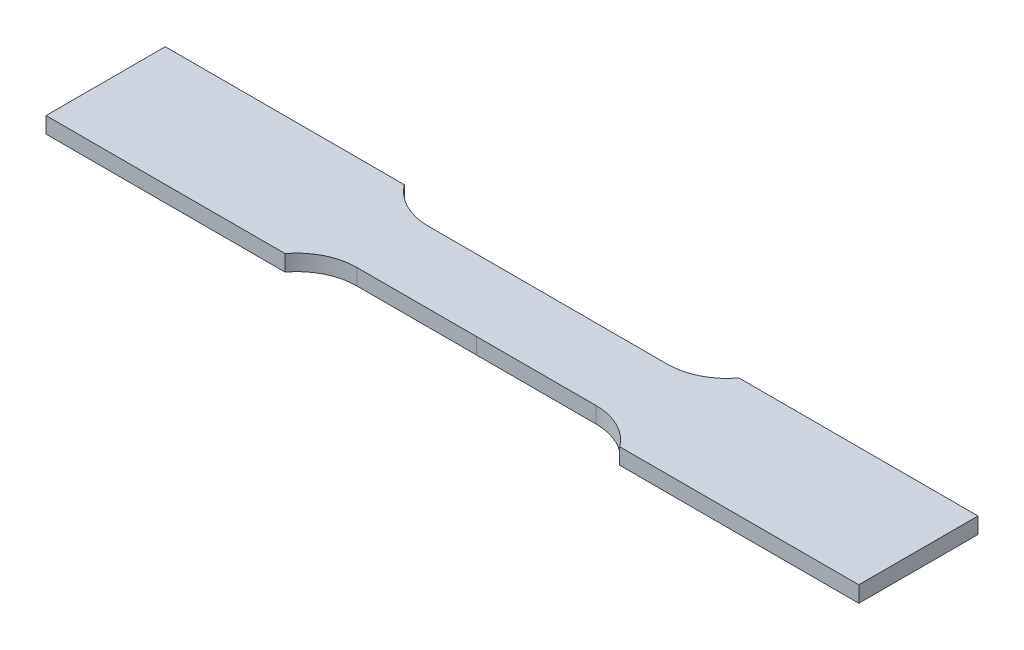
ISO-10303-21;
HEADER;
FILE_DESCRIPTION(('STEP AP214'),'2;1');
FILE_NAME('part.step','',(''),(''),'','','');
FILE_SCHEMA(('AUTOMOTIVE_DESIGN { 1 0 10303 214 1 1 1 1 }'));
ENDSEC;
DATA;
#1=APPLICATION_CONTEXT('core data for automotive mechanical design processes');
#2=APPLICATION_PROTOCOL_DEFINITION('international standard','automotive_design',2000,#1);
#3=PRODUCT_CONTEXT('',#1,'mechanical');
#4=PRODUCT('Part','Part','',(#3));
#5=PRODUCT_RELATED_PRODUCT_CATEGORY('part','',(#4));
#6=PRODUCT_DEFINITION_FORMATION('','',#4);
#7=PRODUCT_DEFINITION_CONTEXT('part definition',#1,'design');
#8=PRODUCT_DEFINITION('design','',#6,#7);
#9=PRODUCT_DEFINITION_SHAPE('','',#8);
#10=(LENGTH_UNIT() NAMED_UNIT(*) SI_UNIT(.MILLI.,.METRE.));
#11=(NAMED_UNIT(*) PLANE_ANGLE_UNIT() SI_UNIT($,.RADIAN.));
#12=(NAMED_UNIT(*) SI_UNIT($,.STERADIAN.) SOLID_ANGLE_UNIT());
#13=UNCERTAINTY_MEASURE_WITH_UNIT(LENGTH_MEASURE(1.E-05),#10,'distance_accuracy_value','');
#14=(GEOMETRIC_REPRESENTATION_CONTEXT(3) GLOBAL_UNCERTAINTY_ASSIGNED_CONTEXT((#13)) GLOBAL_UNIT_ASSIGNED_CONTEXT((#10,
#11,#12)) REPRESENTATION_CONTEXT('',''));
#15=CARTESIAN_POINT('',(0.,0.,0.));
#16=DIRECTION('',(0.,0.,1.));
#17=DIRECTION('',(1.,0.,0.));
#18=AXIS2_PLACEMENT_3D('',#15,#16,#17);
#19=CARTESIAN_POINT('',(0.,3.357,-12.4666675736266));
#20=DIRECTION('',(0.,0.,-1.));
#21=DIRECTION('',(-1.,0.,0.));
#22=AXIS2_PLACEMENT_3D('',#19,#20,#21);
#23=PLANE('',#22);
#24=DIRECTION('',(1.,0.,0.));
#25=VECTOR('',#24,1.);
#26=CARTESIAN_POINT('',(0.,0.,-12.4666675736266));
#27=LINE('',#26,#25);
#28=CARTESIAN_POINT('',(35.,0.,-12.4666675736266));
#29=VERTEX_POINT('',#28);
#30=CARTESIAN_POINT('',(85.,0.,-12.4666675736266));
#31=VERTEX_POINT('',#30);
#32=EDGE_CURVE('E168',#29,#31,#27,.T.);
#33=ORIENTED_EDGE('',*,*,#32,.F.);
#34=DIRECTION('',(0.,-1.,0.));
#35=VECTOR('',#34,1.);
#36=CARTESIAN_POINT('',(35.,3.357,-12.4666675736266));
#37=LINE('',#36,#35);
#38=CARTESIAN_POINT('',(35.,3.357,-12.4666675736266));
#39=VERTEX_POINT('',#38);
#40=EDGE_CURVE('E11',#39,#29,#37,.T.);
#41=ORIENTED_EDGE('',*,*,#40,.F.);
#42=DIRECTION('',(1.,0.,0.));
#43=VECTOR('',#42,1.);
#44=CARTESIAN_POINT('',(0.,3.357,-12.4666675736266));
#45=LINE('',#44,#43);
#46=CARTESIAN_POINT('',(85.,3.357,-12.4666675736266));
#47=VERTEX_POINT('',#46);
#48=EDGE_CURVE('E201',#39,#47,#45,.T.);
#49=ORIENTED_EDGE('',*,*,#48,.T.);
#50=DIRECTION('',(0.,-1.,0.));
#51=VECTOR('',#50,1.);
#52=CARTESIAN_POINT('',(85.,3.357,-12.4666675736266));
#53=LINE('',#52,#51);
#54=EDGE_CURVE('E53',#47,#31,#53,.T.);
#55=ORIENTED_EDGE('',*,*,#54,.T.);
#56=EDGE_LOOP('',(#33,#41,#49,#55));
#57=FACE_BOUND('',#56,.T.);
#58=ADVANCED_FACE('F37',(#57),#23,.T.);
#59=CARTESIAN_POINT('',(25.00249999995,3.357,-19.96999975));
#60=DIRECTION('',(0.,-1.,0.));
#61=DIRECTION('',(0.,0.,-1.));
#62=AXIS2_PLACEMENT_3D('',#59,#60,#61);
#63=CYLINDRICAL_SURFACE('',#62,12.5);
#64=CARTESIAN_POINT('',(25.00249999995,0.,-19.96999975));
#65=DIRECTION('',(0.,1.,0.));
#66=DIRECTION('',(0.,0.,1.));
#67=AXIS2_PLACEMENT_3D('',#64,#65,#66);
#68=CIRCLE('',#67,12.5);
#69=CARTESIAN_POINT('',(25.,0.,-7.47000000000001));
#70=VERTEX_POINT('',#69);
#71=EDGE_CURVE('E170',#29,#70,#68,.F.);
#72=ORIENTED_EDGE('',*,*,#71,.T.);
#73=DIRECTION('',(0.,-1.,0.));
#74=VECTOR('',#73,1.);
#75=CARTESIAN_POINT('',(25.,3.357,-7.47000000000001));
#76=LINE('',#75,#74);
#77=CARTESIAN_POINT('',(25.,3.357,-7.47000000000001));
#78=VERTEX_POINT('',#77);
#79=EDGE_CURVE('E45',#78,#70,#76,.T.);
#80=ORIENTED_EDGE('',*,*,#79,.F.);
#81=CARTESIAN_POINT('',(25.00249999995,3.357,-19.96999975));
#82=DIRECTION('',(0.,1.,0.));
#83=DIRECTION('',(0.,0.,1.));
#84=AXIS2_PLACEMENT_3D('',#81,#82,#83);
#85=CIRCLE('',#84,12.5);
#86=EDGE_CURVE('E250',#39,#78,#85,.F.);
#87=ORIENTED_EDGE('',*,*,#86,.F.);
#88=ORIENTED_EDGE('',*,*,#40,.T.);
#89=EDGE_LOOP('',(#72,#80,#87,#88));
#90=FACE_BOUND('',#89,.T.);
#91=ADVANCED_FACE('F283',(#90),#63,.F.);
#92=CARTESIAN_POINT('',(0.00149499994019839,3.357,-7.47499970100002));
#93=DIRECTION('',(-0.000199999995999784,0.,0.999999980000001));
#94=DIRECTION('',(0.999999980000001,0.,0.000199999995999784));
#95=AXIS2_PLACEMENT_3D('',#92,#93,#94);
#96=PLANE('',#95);
#97=DIRECTION('',(-0.999999980000001,0.,-0.000199999995999784));
#98=VECTOR('',#97,1.);
#99=CARTESIAN_POINT('',(0.00149499994019839,0.,-7.47499970100002));
#100=LINE('',#99,#98);
#101=CARTESIAN_POINT('',(0.,0.,-7.475));
#102=VERTEX_POINT('',#101);
#103=EDGE_CURVE('E172',#70,#102,#100,.T.);
#104=ORIENTED_EDGE('',*,*,#103,.T.);
#105=DIRECTION('',(0.,-1.,0.));
#106=VECTOR('',#105,1.);
#107=CARTESIAN_POINT('',(0.,3.357,-7.475));
#108=LINE('',#107,#106);
#109=CARTESIAN_POINT('',(0.,3.357,-7.475));
#110=VERTEX_POINT('',#109);
#111=EDGE_CURVE('E222',#110,#102,#108,.T.);
#112=ORIENTED_EDGE('',*,*,#111,.F.);
#113=DIRECTION('',(-0.999999980000001,0.,-0.000199999995999784));
#114=VECTOR('',#113,1.);
#115=CARTESIAN_POINT('',(0.00149499994019839,3.357,-7.47499970100002));
#116=LINE('',#115,#114);
#117=EDGE_CURVE('E231',#78,#110,#116,.T.);
#118=ORIENTED_EDGE('',*,*,#117,.F.);
#119=ORIENTED_EDGE('',*,*,#79,.T.);
#120=EDGE_LOOP('',(#104,#112,#118,#119));
#121=FACE_BOUND('',#120,.T.);
#122=ADVANCED_FACE('F229',(#121),#96,.F.);
#123=CARTESIAN_POINT('',(0.,3.357,-7.475));
#124=DIRECTION('',(0.,0.,1.));
#125=DIRECTION('',(1.,0.,0.));
#126=AXIS2_PLACEMENT_3D('',#123,#124,#125);
#127=PLANE('',#126);
#128=DIRECTION('',(-1.,0.,0.));
#129=VECTOR('',#128,1.);
#130=CARTESIAN_POINT('',(0.,0.,-7.475));
#131=LINE('',#130,#129);
#132=CARTESIAN_POINT('',(-25.,0.,-7.475));
#133=VERTEX_POINT('',#132);
#134=EDGE_CURVE('E174',#102,#133,#131,.T.);
#135=ORIENTED_EDGE('',*,*,#134,.T.);
#136=DIRECTION('',(0.,-1.,0.));
#137=VECTOR('',#136,1.);
#138=CARTESIAN_POINT('',(-25.,3.357,-7.475));
#139=LINE('',#138,#137);
#140=CARTESIAN_POINT('',(-25.,3.357,-7.475));
#141=VERTEX_POINT('',#140);
#142=EDGE_CURVE('E220',#141,#133,#139,.T.);
#143=ORIENTED_EDGE('',*,*,#142,.F.);
#144=DIRECTION('',(-1.,0.,0.));
#145=VECTOR('',#144,1.);
#146=CARTESIAN_POINT('',(0.,3.357,-7.475));
#147=LINE('',#146,#145);
#148=EDGE_CURVE('E244',#110,#141,#147,.T.);
#149=ORIENTED_EDGE('',*,*,#148,.F.);
#150=ORIENTED_EDGE('',*,*,#111,.T.);
#151=EDGE_LOOP('',(#135,#143,#149,#150));
#152=FACE_BOUND('',#151,.T.);
#153=ADVANCED_FACE('F241',(#152),#127,.F.);
#154=CARTESIAN_POINT('',(-25.,3.357,-19.975));
#155=DIRECTION('',(0.,-1.,0.));
#156=DIRECTION('',(0.,0.,-1.));
#157=AXIS2_PLACEMENT_3D('',#154,#155,#156);
#158=CYLINDRICAL_SURFACE('',#157,12.5);
#159=CARTESIAN_POINT('',(-25.,0.,-19.975));
#160=DIRECTION('',(0.,1.,0.));
#161=DIRECTION('',(0.,0.,1.));
#162=AXIS2_PLACEMENT_3D('',#159,#160,#161);
#163=CIRCLE('',#162,12.5);
#164=CARTESIAN_POINT('',(-35.,0.,-12.475));
#165=VERTEX_POINT('',#164);
#166=EDGE_CURVE('E177',#165,#133,#163,.T.);
#167=ORIENTED_EDGE('',*,*,#166,.F.);
#168=DIRECTION('',(0.,-1.,0.));
#169=VECTOR('',#168,1.);
#170=CARTESIAN_POINT('',(-35.,3.357,-12.475));
#171=LINE('',#170,#169);
#172=CARTESIAN_POINT('',(-35.,3.357,-12.475));
#173=VERTEX_POINT('',#172);
#174=EDGE_CURVE('E218',#173,#165,#171,.T.);
#175=ORIENTED_EDGE('',*,*,#174,.F.);
#176=CARTESIAN_POINT('',(-25.,3.357,-19.975));
#177=DIRECTION('',(0.,1.,0.));
#178=DIRECTION('',(0.,0.,1.));
#179=AXIS2_PLACEMENT_3D('',#176,#177,#178);
#180=CIRCLE('',#179,12.5);
#181=EDGE_CURVE('E246',#173,#141,#180,.T.);
#182=ORIENTED_EDGE('',*,*,#181,.T.);
#183=ORIENTED_EDGE('',*,*,#142,.T.);
#184=EDGE_LOOP('',(#167,#175,#182,#183));
#185=FACE_BOUND('',#184,.T.);
#186=ADVANCED_FACE('F294',(#185),#158,.F.);
#187=CARTESIAN_POINT('',(0.,3.357,-12.475));
#188=DIRECTION('',(0.,0.,1.));
#189=DIRECTION('',(1.,0.,0.));
#190=AXIS2_PLACEMENT_3D('',#187,#188,#189);
#191=PLANE('',#190);
#192=DIRECTION('',(-1.,0.,0.));
#193=VECTOR('',#192,1.);
#194=CARTESIAN_POINT('',(0.,0.,-12.475));
#195=LINE('',#194,#193);
#196=CARTESIAN_POINT('',(-85.,0.,-12.475));
#197=VERTEX_POINT('',#196);
#198=EDGE_CURVE('E180',#165,#197,#195,.T.);
#199=ORIENTED_EDGE('',*,*,#198,.T.);
#200=DIRECTION('',(0.,-1.,0.));
#201=VECTOR('',#200,1.);
#202=CARTESIAN_POINT('',(-85.,3.357,-12.475));
#203=LINE('',#202,#201);
#204=CARTESIAN_POINT('',(-85.,3.357,-12.475));
#205=VERTEX_POINT('',#204);
#206=EDGE_CURVE('E215',#205,#197,#203,.T.);
#207=ORIENTED_EDGE('',*,*,#206,.F.);
#208=DIRECTION('',(-1.,0.,0.));
#209=VECTOR('',#208,1.);
#210=CARTESIAN_POINT('',(0.,3.357,-12.475));
#211=LINE('',#210,#209);
#212=EDGE_CURVE('E248',#173,#205,#211,.T.);
#213=ORIENTED_EDGE('',*,*,#212,.F.);
#214=ORIENTED_EDGE('',*,*,#174,.T.);
#215=EDGE_LOOP('',(#199,#207,#213,#214));
#216=FACE_BOUND('',#215,.T.);
#217=ADVANCED_FACE('F297',(#216),#191,.F.);
#218=CARTESIAN_POINT('',(-85.,3.357,0.));
#219=DIRECTION('',(1.,0.,0.));
#220=DIRECTION('',(0.,0.,-1.));
#221=AXIS2_PLACEMENT_3D('',#218,#219,#220);
#222=PLANE('',#221);
#223=DIRECTION('',(0.,0.,1.));
#224=VECTOR('',#223,1.);
#225=CARTESIAN_POINT('',(-85.,0.,0.));
#226=LINE('',#225,#224);
#227=CARTESIAN_POINT('',(-85.,0.,12.475));
#228=VERTEX_POINT('',#227);
#229=EDGE_CURVE('E182',#197,#228,#226,.T.);
#230=ORIENTED_EDGE('',*,*,#229,.T.);
#231=DIRECTION('',(0.,-1.,0.));
#232=VECTOR('',#231,1.);
#233=CARTESIAN_POINT('',(-85.,3.357,12.475));
#234=LINE('',#233,#232);
#235=CARTESIAN_POINT('',(-85.,3.357,12.475));
#236=VERTEX_POINT('',#235);
#237=EDGE_CURVE('E213',#236,#228,#234,.T.);
#238=ORIENTED_EDGE('',*,*,#237,.F.);
#239=DIRECTION('',(0.,0.,1.));
#240=VECTOR('',#239,1.);
#241=CARTESIAN_POINT('',(-85.,3.357,0.));
#242=LINE('',#241,#240);
#243=EDGE_CURVE('E255',#205,#236,#242,.T.);
#244=ORIENTED_EDGE('',*,*,#243,.F.);
#245=ORIENTED_EDGE('',*,*,#206,.T.);
#246=EDGE_LOOP('',(#230,#238,#244,#245));
#247=FACE_BOUND('',#246,.T.);
#248=ADVANCED_FACE('F301',(#247),#222,.F.);
#249=CARTESIAN_POINT('',(0.,3.357,12.475));
#250=DIRECTION('',(0.,0.,1.));
#251=DIRECTION('',(1.,0.,0.));
#252=AXIS2_PLACEMENT_3D('',#249,#250,#251);
#253=PLANE('',#252);
#254=DIRECTION('',(-1.,0.,0.));
#255=VECTOR('',#254,1.);
#256=CARTESIAN_POINT('',(0.,0.,12.475));
#257=LINE('',#256,#255);
#258=CARTESIAN_POINT('',(-35.,0.,12.475));
#259=VERTEX_POINT('',#258);
#260=EDGE_CURVE('E185',#259,#228,#257,.T.);
#261=ORIENTED_EDGE('',*,*,#260,.F.);
#262=DIRECTION('',(0.,-1.,0.));
#263=VECTOR('',#262,1.);
#264=CARTESIAN_POINT('',(-35.,3.357,12.475));
#265=LINE('',#264,#263);
#266=CARTESIAN_POINT('',(-35.,3.357,12.475));
#267=VERTEX_POINT('',#266);
#268=EDGE_CURVE('E211',#267,#259,#265,.T.);
#269=ORIENTED_EDGE('',*,*,#268,.F.);
#270=DIRECTION('',(-1.,0.,0.));
#271=VECTOR('',#270,1.);
#272=CARTESIAN_POINT('',(0.,3.357,12.475));
#273=LINE('',#272,#271);
#274=EDGE_CURVE('E257',#267,#236,#273,.T.);
#275=ORIENTED_EDGE('',*,*,#274,.T.);
#276=ORIENTED_EDGE('',*,*,#237,.T.);
#277=EDGE_LOOP('',(#261,#269,#275,#276));
#278=FACE_BOUND('',#277,.T.);
#279=ADVANCED_FACE('F305',(#278),#253,.T.);
#280=CARTESIAN_POINT('',(-25.,3.357,19.975));
#281=DIRECTION('',(0.,-1.,0.));
#282=DIRECTION('',(0.,0.,-1.));
#283=AXIS2_PLACEMENT_3D('',#280,#281,#282);
#284=CYLINDRICAL_SURFACE('',#283,12.5);
#285=CARTESIAN_POINT('',(-25.,0.,19.975));
#286=DIRECTION('',(0.,1.,0.));
#287=DIRECTION('',(0.,0.,1.));
#288=AXIS2_PLACEMENT_3D('',#285,#286,#287);
#289=CIRCLE('',#288,12.5);
#290=CARTESIAN_POINT('',(-25.,0.,7.475));
#291=VERTEX_POINT('',#290);
#292=EDGE_CURVE('E188',#259,#291,#289,.F.);
#293=ORIENTED_EDGE('',*,*,#292,.T.);
#294=DIRECTION('',(0.,-1.,0.));
#295=VECTOR('',#294,1.);
#296=CARTESIAN_POINT('',(-25.,3.357,7.475));
#297=LINE('',#296,#295);
#298=CARTESIAN_POINT('',(-25.,3.357,7.475));
#299=VERTEX_POINT('',#298);
#300=EDGE_CURVE('E208',#299,#291,#297,.T.);
#301=ORIENTED_EDGE('',*,*,#300,.F.);
#302=CARTESIAN_POINT('',(-25.,3.357,19.975));
#303=DIRECTION('',(0.,1.,0.));
#304=DIRECTION('',(0.,0.,1.));
#305=AXIS2_PLACEMENT_3D('',#302,#303,#304);
#306=CIRCLE('',#305,12.5);
#307=EDGE_CURVE('E260',#267,#299,#306,.F.);
#308=ORIENTED_EDGE('',*,*,#307,.F.);
#309=ORIENTED_EDGE('',*,*,#268,.T.);
#310=EDGE_LOOP('',(#293,#301,#308,#309));
#311=FACE_BOUND('',#310,.T.);
#312=ADVANCED_FACE('F309',(#311),#284,.F.);
#313=CARTESIAN_POINT('',(0.,3.357,7.475));
#314=DIRECTION('',(0.,0.,-1.));
#315=DIRECTION('',(-1.,0.,0.));
#316=AXIS2_PLACEMENT_3D('',#313,#314,#315);
#317=PLANE('',#316);
#318=DIRECTION('',(1.,0.,0.));
#319=VECTOR('',#318,1.);
#320=CARTESIAN_POINT('',(0.,0.,7.475));
#321=LINE('',#320,#319);
#322=CARTESIAN_POINT('',(0.,0.,7.475));
#323=VERTEX_POINT('',#322);
#324=EDGE_CURVE('E190',#291,#323,#321,.T.);
#325=ORIENTED_EDGE('',*,*,#324,.T.);
#326=DIRECTION('',(0.,-1.,0.));
#327=VECTOR('',#326,1.);
#328=CARTESIAN_POINT('',(0.,3.357,7.475));
#329=LINE('',#328,#327);
#330=CARTESIAN_POINT('',(0.,3.357,7.475));
#331=VERTEX_POINT('',#330);
#332=EDGE_CURVE('E205',#331,#323,#329,.T.);
#333=ORIENTED_EDGE('',*,*,#332,.F.);
#334=DIRECTION('',(1.,0.,0.));
#335=VECTOR('',#334,1.);
#336=CARTESIAN_POINT('',(0.,3.357,7.475));
#337=LINE('',#336,#335);
#338=EDGE_CURVE('E163',#299,#331,#337,.T.);
#339=ORIENTED_EDGE('',*,*,#338,.F.);
#340=ORIENTED_EDGE('',*,*,#300,.T.);
#341=EDGE_LOOP('',(#325,#333,#339,#340));
#342=FACE_BOUND('',#341,.T.);
#343=ADVANCED_FACE('F267',(#342),#317,.F.);
#344=CARTESIAN_POINT('',(0.0014949999402015,3.357,7.47499970100001));
#345=DIRECTION('',(-0.0001999999960002,0.,-0.999999980000001));
#346=DIRECTION('',(-0.999999980000001,0.,0.0001999999960002));
#347=AXIS2_PLACEMENT_3D('',#344,#345,#346);
#348=PLANE('',#347);
#349=DIRECTION('',(0.999999980000001,0.,-0.0001999999960002));
#350=VECTOR('',#349,1.);
#351=CARTESIAN_POINT('',(0.0014949999402015,0.,7.47499970100001));
#352=LINE('',#351,#350);
#353=CARTESIAN_POINT('',(25.,0.,7.46999999999999));
#354=VERTEX_POINT('',#353);
#355=EDGE_CURVE('E192',#323,#354,#352,.T.);
#356=ORIENTED_EDGE('',*,*,#355,.T.);
#357=DIRECTION('',(0.,-1.,0.));
#358=VECTOR('',#357,1.);
#359=CARTESIAN_POINT('',(25.,3.357,7.46999999999999));
#360=LINE('',#359,#358);
#361=CARTESIAN_POINT('',(25.,3.357,7.46999999999999));
#362=VERTEX_POINT('',#361);
#363=EDGE_CURVE('E149',#362,#354,#360,.T.);
#364=ORIENTED_EDGE('',*,*,#363,.F.);
#365=DIRECTION('',(0.999999980000001,0.,-0.0001999999960002));
#366=VECTOR('',#365,1.);
#367=CARTESIAN_POINT('',(0.0014949999402015,3.357,7.47499970100001));
#368=LINE('',#367,#366);
#369=EDGE_CURVE('E160',#331,#362,#368,.T.);
#370=ORIENTED_EDGE('',*,*,#369,.F.);
#371=ORIENTED_EDGE('',*,*,#332,.T.);
#372=EDGE_LOOP('',(#356,#364,#370,#371));
#373=FACE_BOUND('',#372,.T.);
#374=ADVANCED_FACE('F271',(#373),#348,.F.);
#375=CARTESIAN_POINT('',(25.00249999995,3.357,19.96999975));
#376=DIRECTION('',(0.,-1.,0.));
#377=DIRECTION('',(0.,0.,-1.));
#378=AXIS2_PLACEMENT_3D('',#375,#376,#377);
#379=CYLINDRICAL_SURFACE('',#378,12.5);
#380=CARTESIAN_POINT('',(25.00249999995,0.,19.96999975));
#381=DIRECTION('',(0.,1.,0.));
#382=DIRECTION('',(0.,0.,1.));
#383=AXIS2_PLACEMENT_3D('',#380,#381,#382);
#384=CIRCLE('',#383,12.5);
#385=CARTESIAN_POINT('',(35.,0.,12.4666675736266));
#386=VERTEX_POINT('',#385);
#387=EDGE_CURVE('E146',#386,#354,#384,.T.);
#388=ORIENTED_EDGE('',*,*,#387,.F.);
#389=DIRECTION('',(0.,-1.,0.));
#390=VECTOR('',#389,1.);
#391=CARTESIAN_POINT('',(35.,3.357,12.4666675736266));
#392=LINE('',#391,#390);
#393=CARTESIAN_POINT('',(35.,3.357,12.4666675736266));
#394=VERTEX_POINT('',#393);
#395=EDGE_CURVE('E140',#394,#386,#392,.T.);
#396=ORIENTED_EDGE('',*,*,#395,.F.);
#397=CARTESIAN_POINT('',(25.00249999995,3.357,19.96999975));
#398=DIRECTION('',(0.,1.,0.));
#399=DIRECTION('',(0.,0.,1.));
#400=AXIS2_PLACEMENT_3D('',#397,#398,#399);
#401=CIRCLE('',#400,12.5);
#402=EDGE_CURVE('E144',#394,#362,#401,.T.);
#403=ORIENTED_EDGE('',*,*,#402,.T.);
#404=ORIENTED_EDGE('',*,*,#363,.T.);
#405=EDGE_LOOP('',(#388,#396,#403,#404));
#406=FACE_BOUND('',#405,.T.);
#407=ADVANCED_FACE('F142',(#406),#379,.F.);
#408=CARTESIAN_POINT('',(0.,3.357,12.4666675736266));
#409=DIRECTION('',(0.,0.,-1.));
#410=DIRECTION('',(-1.,0.,0.));
#411=AXIS2_PLACEMENT_3D('',#408,#409,#410);
#412=PLANE('',#411);
#413=DIRECTION('',(1.,0.,0.));
#414=VECTOR('',#413,1.);
#415=CARTESIAN_POINT('',(0.,0.,12.4666675736266));
#416=LINE('',#415,#414);
#417=CARTESIAN_POINT('',(85.,0.,12.4666675736266));
#418=VERTEX_POINT('',#417);
#419=EDGE_CURVE('E196',#386,#418,#416,.T.);
#420=ORIENTED_EDGE('',*,*,#419,.T.);
#421=DIRECTION('',(0.,-1.,0.));
#422=VECTOR('',#421,1.);
#423=CARTESIAN_POINT('',(85.,3.357,12.4666675736266));
#424=LINE('',#423,#422);
#425=CARTESIAN_POINT('',(85.,3.357,12.4666675736266));
#426=VERTEX_POINT('',#425);
#427=EDGE_CURVE('E97',#426,#418,#424,.T.);
#428=ORIENTED_EDGE('',*,*,#427,.F.);
#429=DIRECTION('',(1.,0.,0.));
#430=VECTOR('',#429,1.);
#431=CARTESIAN_POINT('',(0.,3.357,12.4666675736266));
#432=LINE('',#431,#430);
#433=EDGE_CURVE('E151',#394,#426,#432,.T.);
#434=ORIENTED_EDGE('',*,*,#433,.F.);
#435=ORIENTED_EDGE('',*,*,#395,.T.);
#436=EDGE_LOOP('',(#420,#428,#434,#435));
#437=FACE_BOUND('',#436,.T.);
#438=ADVANCED_FACE('F152',(#437),#412,.F.);
#439=CARTESIAN_POINT('',(85.,3.357,0.));
#440=DIRECTION('',(1.,0.,0.));
#441=DIRECTION('',(0.,0.,-1.));
#442=AXIS2_PLACEMENT_3D('',#439,#440,#441);
#443=PLANE('',#442);
#444=DIRECTION('',(0.,0.,1.));
#445=VECTOR('',#444,1.);
#446=CARTESIAN_POINT('',(85.,0.,0.));
#447=LINE('',#446,#445);
#448=EDGE_CURVE('E198',#31,#418,#447,.T.);
#449=ORIENTED_EDGE('',*,*,#448,.F.);
#450=ORIENTED_EDGE('',*,*,#54,.F.);
#451=DIRECTION('',(0.,0.,1.));
#452=VECTOR('',#451,1.);
#453=CARTESIAN_POINT('',(85.,3.357,0.));
#454=LINE('',#453,#452);
#455=EDGE_CURVE('E155',#47,#426,#454,.T.);
#456=ORIENTED_EDGE('',*,*,#455,.T.);
#457=ORIENTED_EDGE('',*,*,#427,.T.);
#458=EDGE_LOOP('',(#449,#450,#456,#457));
#459=FACE_BOUND('',#458,.T.);
#460=ADVANCED_FACE('F272',(#459),#443,.T.);
#461=CARTESIAN_POINT('',(0.,3.357,0.));
#462=DIRECTION('',(0.,1.,0.));
#463=DIRECTION('',(0.,0.,1.));
#464=AXIS2_PLACEMENT_3D('',#461,#462,#463);
#465=PLANE('',#464);
#466=ORIENTED_EDGE('',*,*,#48,.F.);
#467=ORIENTED_EDGE('',*,*,#86,.T.);
#468=ORIENTED_EDGE('',*,*,#117,.T.);
#469=ORIENTED_EDGE('',*,*,#148,.T.);
#470=ORIENTED_EDGE('',*,*,#181,.F.);
#471=ORIENTED_EDGE('',*,*,#212,.T.);
#472=ORIENTED_EDGE('',*,*,#243,.T.);
#473=ORIENTED_EDGE('',*,*,#274,.F.);
#474=ORIENTED_EDGE('',*,*,#307,.T.);
#475=ORIENTED_EDGE('',*,*,#338,.T.);
#476=ORIENTED_EDGE('',*,*,#369,.T.);
#477=ORIENTED_EDGE('',*,*,#402,.F.);
#478=ORIENTED_EDGE('',*,*,#433,.T.);
#479=ORIENTED_EDGE('',*,*,#455,.F.);
#480=EDGE_LOOP('',(#466,#467,#468,#469,#470,#471,#472,#473,#474,#475,#476,#477,#478,#479));
#481=FACE_BOUND('',#480,.T.);
#482=ADVANCED_FACE('F158',(#481),#465,.T.);
#483=CARTESIAN_POINT('',(0.,0.,0.));
#484=DIRECTION('',(0.,1.,0.));
#485=DIRECTION('',(0.,0.,1.));
#486=AXIS2_PLACEMENT_3D('',#483,#484,#485);
#487=PLANE('',#486);
#488=ORIENTED_EDGE('',*,*,#32,.T.);
#489=ORIENTED_EDGE('',*,*,#448,.T.);
#490=ORIENTED_EDGE('',*,*,#419,.F.);
#491=ORIENTED_EDGE('',*,*,#387,.T.);
#492=ORIENTED_EDGE('',*,*,#355,.F.);
#493=ORIENTED_EDGE('',*,*,#324,.F.);
#494=ORIENTED_EDGE('',*,*,#292,.F.);
#495=ORIENTED_EDGE('',*,*,#260,.T.);
#496=ORIENTED_EDGE('',*,*,#229,.F.);
#497=ORIENTED_EDGE('',*,*,#198,.F.);
#498=ORIENTED_EDGE('',*,*,#166,.T.);
#499=ORIENTED_EDGE('',*,*,#134,.F.);
#500=ORIENTED_EDGE('',*,*,#103,.F.);
#501=ORIENTED_EDGE('',*,*,#71,.F.);
#502=EDGE_LOOP('',(#488,#489,#490,#491,#492,#493,#494,#495,#496,#497,#498,#499,#500,#501));
#503=FACE_BOUND('',#502,.T.);
#504=ADVANCED_FACE('F236',(#503),#487,.F.);
#505=CLOSED_SHELL('',(#58,#91,#122,#153,#186,#217,#248,#279,#312,#343,#374,#407,#438,#460,#482,#504));
#506=MANIFOLD_SOLID_BREP('B2',#505);
#507=ADVANCED_BREP_SHAPE_REPRESENTATION('',(#18,#506),#14);
#508=SHAPE_DEFINITION_REPRESENTATION(#9,#507);
ENDSEC;
END-ISO-10303-21;
